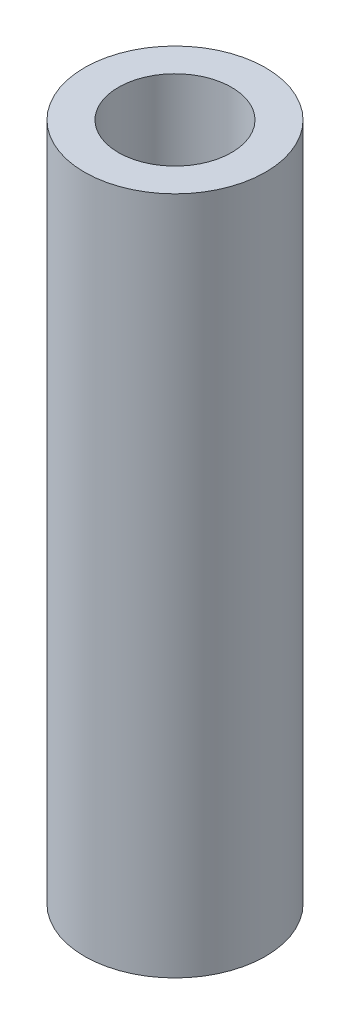
ISO-10303-21;
HEADER;
FILE_DESCRIPTION(('STEP AP214'),'2;1');
FILE_NAME('part.step','',(''),(''),'','','');
FILE_SCHEMA(('AUTOMOTIVE_DESIGN { 1 0 10303 214 1 1 1 1 }'));
ENDSEC;
DATA;
#1=APPLICATION_CONTEXT('core data for automotive mechanical design processes');
#2=APPLICATION_PROTOCOL_DEFINITION('international standard','automotive_design',2000,#1);
#3=PRODUCT_CONTEXT('',#1,'mechanical');
#4=PRODUCT('Part','Part','',(#3));
#5=PRODUCT_RELATED_PRODUCT_CATEGORY('part','',(#4));
#6=PRODUCT_DEFINITION_FORMATION('','',#4);
#7=PRODUCT_DEFINITION_CONTEXT('part definition',#1,'design');
#8=PRODUCT_DEFINITION('design','',#6,#7);
#9=PRODUCT_DEFINITION_SHAPE('','',#8);
#10=(LENGTH_UNIT() NAMED_UNIT(*) SI_UNIT(.MILLI.,.METRE.));
#11=(NAMED_UNIT(*) PLANE_ANGLE_UNIT() SI_UNIT($,.RADIAN.));
#12=(NAMED_UNIT(*) SI_UNIT($,.STERADIAN.) SOLID_ANGLE_UNIT());
#13=UNCERTAINTY_MEASURE_WITH_UNIT(LENGTH_MEASURE(1.E-05),#10,'distance_accuracy_value','');
#14=(GEOMETRIC_REPRESENTATION_CONTEXT(3) GLOBAL_UNCERTAINTY_ASSIGNED_CONTEXT((#13)) GLOBAL_UNIT_ASSIGNED_CONTEXT((#10,
#11,#12)) REPRESENTATION_CONTEXT('',''));
#15=CARTESIAN_POINT('',(0.,0.,0.));
#16=DIRECTION('',(0.,0.,1.));
#17=DIRECTION('',(1.,0.,0.));
#18=AXIS2_PLACEMENT_3D('',#15,#16,#17);
#19=CARTESIAN_POINT('',(0.,30.,0.));
#20=DIRECTION('',(0.,-1.,0.));
#21=DIRECTION('',(0.,0.,-1.));
#22=AXIS2_PLACEMENT_3D('',#19,#20,#21);
#23=CYLINDRICAL_SURFACE('',#22,4.);
#24=CARTESIAN_POINT('',(0.,30.,0.));
#25=DIRECTION('',(0.,1.,0.));
#26=DIRECTION('',(0.,0.,1.));
#27=AXIS2_PLACEMENT_3D('',#24,#25,#26);
#28=CIRCLE('',#27,4.);
#29=CARTESIAN_POINT('',(0.,30.,4.));
#30=VERTEX_POINT('',#29);
#31=EDGE_CURVE('E10',#30,#30,#28,.T.);
#32=ORIENTED_EDGE('',*,*,#31,.F.);
#33=EDGE_LOOP('',(#32));
#34=FACE_BOUND('',#33,.T.);
#35=CARTESIAN_POINT('',(0.,0.,0.));
#36=DIRECTION('',(0.,1.,0.));
#37=DIRECTION('',(0.,0.,1.));
#38=AXIS2_PLACEMENT_3D('',#35,#36,#37);
#39=CIRCLE('',#38,4.);
#40=CARTESIAN_POINT('',(0.,0.,4.));
#41=VERTEX_POINT('',#40);
#42=EDGE_CURVE('E35',#41,#41,#39,.T.);
#43=ORIENTED_EDGE('',*,*,#42,.T.);
#44=EDGE_LOOP('',(#43));
#45=FACE_BOUND('',#44,.T.);
#46=ADVANCED_FACE('F32',(#34,#45),#23,.T.);
#47=CARTESIAN_POINT('',(0.,30.,0.));
#48=DIRECTION('',(0.,1.,0.));
#49=DIRECTION('',(0.,0.,1.));
#50=AXIS2_PLACEMENT_3D('',#47,#48,#49);
#51=PLANE('',#50);
#52=CARTESIAN_POINT('',(0.,30.,0.));
#53=DIRECTION('',(0.,1.,0.));
#54=DIRECTION('',(0.,0.,1.));
#55=AXIS2_PLACEMENT_3D('',#52,#53,#54);
#56=CIRCLE('',#55,2.5);
#57=CARTESIAN_POINT('',(0.,30.,2.5));
#58=VERTEX_POINT('',#57);
#59=EDGE_CURVE('E44',#58,#58,#56,.T.);
#60=ORIENTED_EDGE('',*,*,#59,.F.);
#61=EDGE_LOOP('',(#60));
#62=FACE_BOUND('',#61,.T.);
#63=ORIENTED_EDGE('',*,*,#31,.T.);
#64=EDGE_LOOP('',(#63));
#65=FACE_BOUND('',#64,.T.);
#66=ADVANCED_FACE('F59',(#62,#65),#51,.T.);
#67=CARTESIAN_POINT('',(0.,0.,0.));
#68=DIRECTION('',(0.,1.,0.));
#69=DIRECTION('',(0.,0.,1.));
#70=AXIS2_PLACEMENT_3D('',#67,#68,#69);
#71=PLANE('',#70);
#72=CARTESIAN_POINT('',(0.,0.,0.));
#73=DIRECTION('',(0.,1.,0.));
#74=DIRECTION('',(0.,0.,1.));
#75=AXIS2_PLACEMENT_3D('',#72,#73,#74);
#76=CIRCLE('',#75,2.5);
#77=CARTESIAN_POINT('',(0.,0.,2.5));
#78=VERTEX_POINT('',#77);
#79=EDGE_CURVE('E42',#78,#78,#76,.T.);
#80=ORIENTED_EDGE('',*,*,#79,.T.);
#81=EDGE_LOOP('',(#80));
#82=FACE_BOUND('',#81,.T.);
#83=ORIENTED_EDGE('',*,*,#42,.F.);
#84=EDGE_LOOP('',(#83));
#85=FACE_BOUND('',#84,.T.);
#86=ADVANCED_FACE('F50',(#82,#85),#71,.F.);
#87=CARTESIAN_POINT('',(0.,0.,0.));
#88=DIRECTION('',(0.,1.,0.));
#89=DIRECTION('',(0.,0.,1.));
#90=AXIS2_PLACEMENT_3D('',#87,#88,#89);
#91=CYLINDRICAL_SURFACE('',#90,2.5);
#92=ORIENTED_EDGE('',*,*,#79,.F.);
#93=EDGE_LOOP('',(#92));
#94=FACE_BOUND('',#93,.T.);
#95=ORIENTED_EDGE('',*,*,#59,.T.);
#96=EDGE_LOOP('',(#95));
#97=FACE_BOUND('',#96,.T.);
#98=ADVANCED_FACE('F53',(#94,#97),#91,.F.);
#99=CLOSED_SHELL('',(#46,#66,#86,#98));
#100=MANIFOLD_SOLID_BREP('B2',#99);
#101=ADVANCED_BREP_SHAPE_REPRESENTATION('',(#18,#100),#14);
#102=SHAPE_DEFINITION_REPRESENTATION(#9,#101);
ENDSEC;
END-ISO-10303-21;
